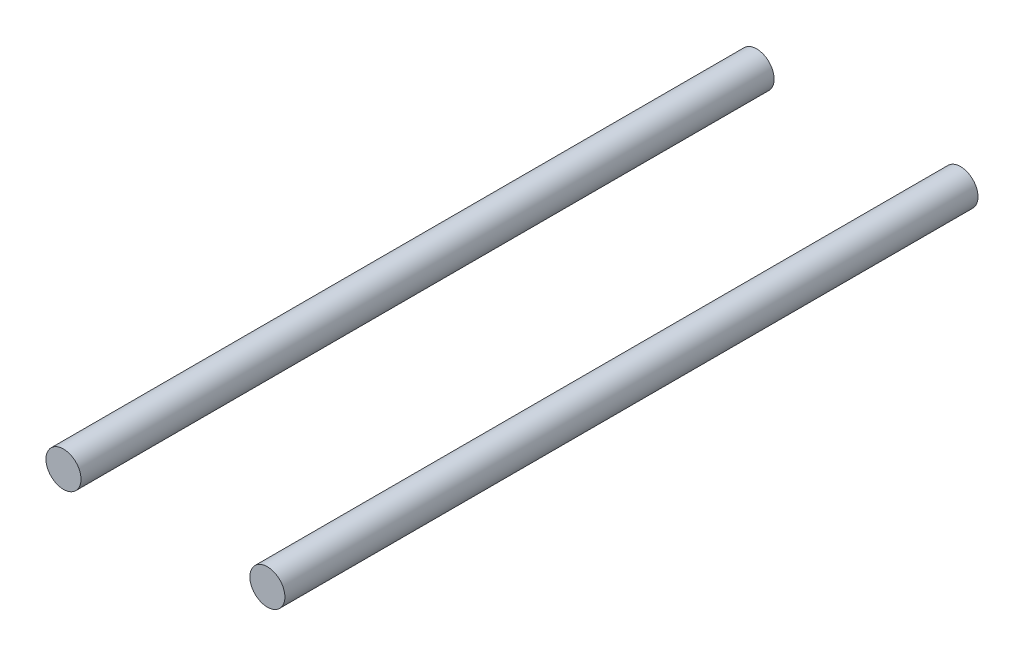
ISO-10303-21;
HEADER;
FILE_DESCRIPTION(('STEP AP214'),'2;1');
FILE_NAME('part.step','',(''),(''),'','','');
FILE_SCHEMA(('AUTOMOTIVE_DESIGN { 1 0 10303 214 1 1 1 1 }'));
ENDSEC;
DATA;
#1=APPLICATION_CONTEXT('core data for automotive mechanical design processes');
#2=APPLICATION_PROTOCOL_DEFINITION('international standard','automotive_design',2000,#1);
#3=PRODUCT_CONTEXT('',#1,'mechanical');
#4=PRODUCT('Part','Part','',(#3));
#5=PRODUCT_RELATED_PRODUCT_CATEGORY('part','',(#4));
#6=PRODUCT_DEFINITION_FORMATION('','',#4);
#7=PRODUCT_DEFINITION_CONTEXT('part definition',#1,'design');
#8=PRODUCT_DEFINITION('design','',#6,#7);
#9=PRODUCT_DEFINITION_SHAPE('','',#8);
#10=(LENGTH_UNIT() NAMED_UNIT(*) SI_UNIT(.MILLI.,.METRE.));
#11=(NAMED_UNIT(*) PLANE_ANGLE_UNIT() SI_UNIT($,.RADIAN.));
#12=(NAMED_UNIT(*) SI_UNIT($,.STERADIAN.) SOLID_ANGLE_UNIT());
#13=UNCERTAINTY_MEASURE_WITH_UNIT(LENGTH_MEASURE(1.E-05),#10,'distance_accuracy_value','');
#14=(GEOMETRIC_REPRESENTATION_CONTEXT(3) GLOBAL_UNCERTAINTY_ASSIGNED_CONTEXT((#13)) GLOBAL_UNIT_ASSIGNED_CONTEXT((#10,
#11,#12)) REPRESENTATION_CONTEXT('',''));
#15=CARTESIAN_POINT('',(0.,0.,0.));
#16=DIRECTION('',(0.,0.,1.));
#17=DIRECTION('',(1.,0.,0.));
#18=AXIS2_PLACEMENT_3D('',#15,#16,#17);
#19=CARTESIAN_POINT('',(29.885,0.,203.2));
#20=DIRECTION('',(0.,0.,-1.));
#21=DIRECTION('',(-1.,0.,0.));
#22=AXIS2_PLACEMENT_3D('',#19,#20,#21);
#23=CYLINDRICAL_SURFACE('',#22,5.135);
#24=CARTESIAN_POINT('',(29.885,0.,203.2));
#25=DIRECTION('',(0.,0.,1.));
#26=DIRECTION('',(1.,0.,0.));
#27=AXIS2_PLACEMENT_3D('',#24,#25,#26);
#28=CIRCLE('',#27,5.135);
#29=CARTESIAN_POINT('',(35.02,0.,203.2));
#30=VERTEX_POINT('',#29);
#31=EDGE_CURVE('E55',#30,#30,#28,.T.);
#32=ORIENTED_EDGE('',*,*,#31,.F.);
#33=EDGE_LOOP('',(#32));
#34=FACE_BOUND('',#33,.T.);
#35=CARTESIAN_POINT('',(29.885,0.,0.));
#36=DIRECTION('',(0.,0.,1.));
#37=DIRECTION('',(1.,0.,0.));
#38=AXIS2_PLACEMENT_3D('',#35,#36,#37);
#39=CIRCLE('',#38,5.135);
#40=CARTESIAN_POINT('',(35.02,0.,0.));
#41=VERTEX_POINT('',#40);
#42=EDGE_CURVE('E11',#41,#41,#39,.T.);
#43=ORIENTED_EDGE('',*,*,#42,.T.);
#44=EDGE_LOOP('',(#43));
#45=FACE_BOUND('',#44,.T.);
#46=ADVANCED_FACE('F51',(#34,#45),#23,.T.);
#47=CARTESIAN_POINT('',(29.885,0.,203.2));
#48=DIRECTION('',(0.,0.,1.));
#49=DIRECTION('',(1.,0.,0.));
#50=AXIS2_PLACEMENT_3D('',#47,#48,#49);
#51=PLANE('',#50);
#52=ORIENTED_EDGE('',*,*,#31,.T.);
#53=EDGE_LOOP('',(#52));
#54=FACE_BOUND('',#53,.T.);
#55=ADVANCED_FACE('F53',(#54),#51,.T.);
#56=CARTESIAN_POINT('',(29.885,0.,0.));
#57=DIRECTION('',(0.,0.,1.));
#58=DIRECTION('',(1.,0.,0.));
#59=AXIS2_PLACEMENT_3D('',#56,#57,#58);
#60=PLANE('',#59);
#61=ORIENTED_EDGE('',*,*,#42,.F.);
#62=EDGE_LOOP('',(#61));
#63=FACE_BOUND('',#62,.T.);
#64=ADVANCED_FACE('F72',(#63),#60,.F.);
#65=CLOSED_SHELL('',(#46,#55,#64));
#66=MANIFOLD_SOLID_BREP('B2',#65);
#67=CARTESIAN_POINT('',(-29.885,0.,203.2));
#68=DIRECTION('',(0.,0.,-1.));
#69=DIRECTION('',(-1.,0.,0.));
#70=AXIS2_PLACEMENT_3D('',#67,#68,#69);
#71=CYLINDRICAL_SURFACE('',#70,5.135);
#72=CARTESIAN_POINT('',(-29.885,0.,203.2));
#73=DIRECTION('',(0.,0.,1.));
#74=DIRECTION('',(1.,0.,0.));
#75=AXIS2_PLACEMENT_3D('',#72,#73,#74);
#76=CIRCLE('',#75,5.135);
#77=CARTESIAN_POINT('',(-24.75,0.,203.2));
#78=VERTEX_POINT('',#77);
#79=EDGE_CURVE('E50',#78,#78,#76,.T.);
#80=ORIENTED_EDGE('',*,*,#79,.F.);
#81=EDGE_LOOP('',(#80));
#82=FACE_BOUND('',#81,.T.);
#83=CARTESIAN_POINT('',(-29.885,0.,0.));
#84=DIRECTION('',(0.,0.,1.));
#85=DIRECTION('',(1.,0.,0.));
#86=AXIS2_PLACEMENT_3D('',#83,#84,#85);
#87=CIRCLE('',#86,5.135);
#88=CARTESIAN_POINT('',(-24.75,0.,0.));
#89=VERTEX_POINT('',#88);
#90=EDGE_CURVE('E97',#89,#89,#87,.T.);
#91=ORIENTED_EDGE('',*,*,#90,.T.);
#92=EDGE_LOOP('',(#91));
#93=FACE_BOUND('',#92,.T.);
#94=ADVANCED_FACE('F94',(#82,#93),#71,.T.);
#95=CARTESIAN_POINT('',(-29.885,0.,203.2));
#96=DIRECTION('',(0.,0.,1.));
#97=DIRECTION('',(1.,0.,0.));
#98=AXIS2_PLACEMENT_3D('',#95,#96,#97);
#99=PLANE('',#98);
#100=ORIENTED_EDGE('',*,*,#79,.T.);
#101=EDGE_LOOP('',(#100));
#102=FACE_BOUND('',#101,.T.);
#103=ADVANCED_FACE('F109',(#102),#99,.T.);
#104=CARTESIAN_POINT('',(-29.885,0.,0.));
#105=DIRECTION('',(0.,0.,1.));
#106=DIRECTION('',(1.,0.,0.));
#107=AXIS2_PLACEMENT_3D('',#104,#105,#106);
#108=PLANE('',#107);
#109=ORIENTED_EDGE('',*,*,#90,.F.);
#110=EDGE_LOOP('',(#109));
#111=FACE_BOUND('',#110,.T.);
#112=ADVANCED_FACE('F107',(#111),#108,.F.);
#113=CLOSED_SHELL('',(#94,#103,#112));
#114=MANIFOLD_SOLID_BREP('B6',#113);
#115=ADVANCED_BREP_SHAPE_REPRESENTATION('',(#18,#66,#114),#14);
#116=SHAPE_DEFINITION_REPRESENTATION(#9,#115);
ENDSEC;
END-ISO-10303-21;
